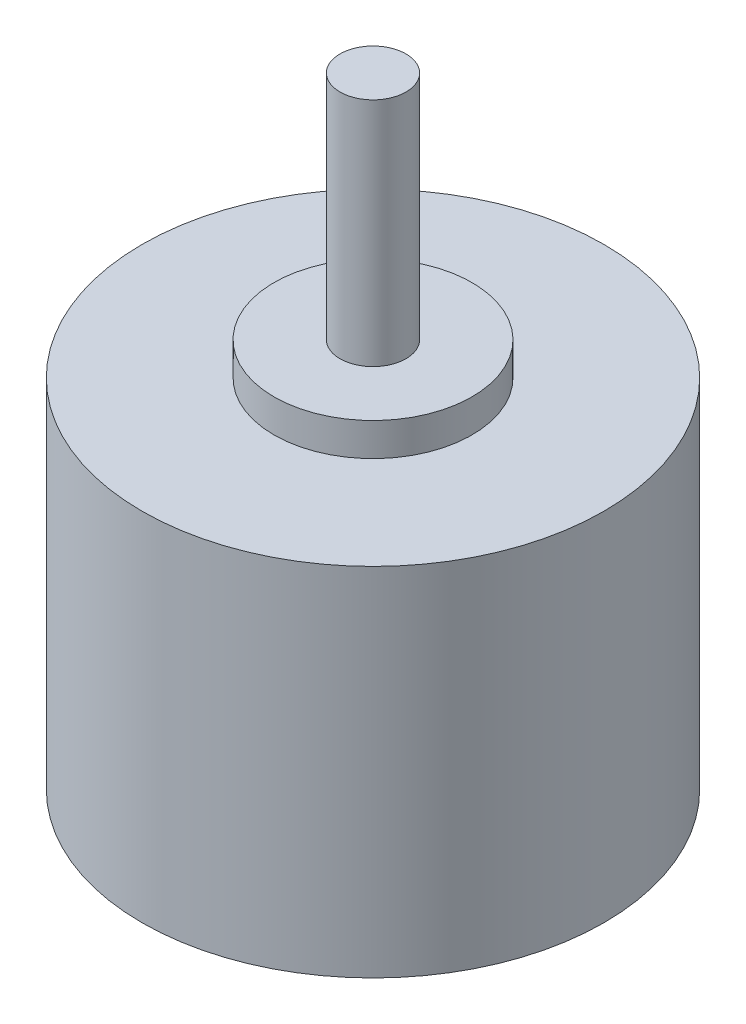
ISO-10303-21;
HEADER;
FILE_DESCRIPTION(('STEP AP214'),'2;1');
FILE_NAME('part.step','',(''),(''),'','','');
FILE_SCHEMA(('AUTOMOTIVE_DESIGN { 1 0 10303 214 1 1 1 1 }'));
ENDSEC;
DATA;
#1=APPLICATION_CONTEXT('core data for automotive mechanical design processes');
#2=APPLICATION_PROTOCOL_DEFINITION('international standard','automotive_design',2000,#1);
#3=PRODUCT_CONTEXT('',#1,'mechanical');
#4=PRODUCT('Part','Part','',(#3));
#5=PRODUCT_RELATED_PRODUCT_CATEGORY('part','',(#4));
#6=PRODUCT_DEFINITION_FORMATION('','',#4);
#7=PRODUCT_DEFINITION_CONTEXT('part definition',#1,'design');
#8=PRODUCT_DEFINITION('design','',#6,#7);
#9=PRODUCT_DEFINITION_SHAPE('','',#8);
#10=(LENGTH_UNIT() NAMED_UNIT(*) SI_UNIT(.MILLI.,.METRE.));
#11=(NAMED_UNIT(*) PLANE_ANGLE_UNIT() SI_UNIT($,.RADIAN.));
#12=(NAMED_UNIT(*) SI_UNIT($,.STERADIAN.) SOLID_ANGLE_UNIT());
#13=UNCERTAINTY_MEASURE_WITH_UNIT(LENGTH_MEASURE(1.E-05),#10,'distance_accuracy_value','');
#14=(GEOMETRIC_REPRESENTATION_CONTEXT(3) GLOBAL_UNCERTAINTY_ASSIGNED_CONTEXT((#13)) GLOBAL_UNIT_ASSIGNED_CONTEXT((#10,
#11,#12)) REPRESENTATION_CONTEXT('',''));
#15=CARTESIAN_POINT('',(0.,0.,0.));
#16=DIRECTION('',(0.,0.,1.));
#17=DIRECTION('',(1.,0.,0.));
#18=AXIS2_PLACEMENT_3D('',#15,#16,#17);
#19=CARTESIAN_POINT('',(0.,27.,0.));
#20=DIRECTION('',(0.,-1.,0.));
#21=DIRECTION('',(0.,0.,-1.));
#22=AXIS2_PLACEMENT_3D('',#19,#20,#21);
#23=CYLINDRICAL_SURFACE('',#22,17.5);
#24=CARTESIAN_POINT('',(0.,27.,0.));
#25=DIRECTION('',(0.,1.,0.));
#26=DIRECTION('',(0.,0.,1.));
#27=AXIS2_PLACEMENT_3D('',#24,#25,#26);
#28=CIRCLE('',#27,17.5);
#29=CARTESIAN_POINT('',(0.,27.,17.5));
#30=VERTEX_POINT('',#29);
#31=EDGE_CURVE('E42',#30,#30,#28,.T.);
#32=ORIENTED_EDGE('',*,*,#31,.F.);
#33=EDGE_LOOP('',(#32));
#34=FACE_BOUND('',#33,.T.);
#35=CARTESIAN_POINT('',(0.,0.,0.));
#36=DIRECTION('',(0.,1.,0.));
#37=DIRECTION('',(0.,0.,1.));
#38=AXIS2_PLACEMENT_3D('',#35,#36,#37);
#39=CIRCLE('',#38,17.5);
#40=CARTESIAN_POINT('',(0.,0.,17.5));
#41=VERTEX_POINT('',#40);
#42=EDGE_CURVE('E33',#41,#41,#39,.T.);
#43=ORIENTED_EDGE('',*,*,#42,.T.);
#44=EDGE_LOOP('',(#43));
#45=FACE_BOUND('',#44,.T.);
#46=ADVANCED_FACE('F30',(#34,#45),#23,.T.);
#47=CARTESIAN_POINT('',(0.,27.,0.));
#48=DIRECTION('',(0.,1.,0.));
#49=DIRECTION('',(0.,0.,1.));
#50=AXIS2_PLACEMENT_3D('',#47,#48,#49);
#51=PLANE('',#50);
#52=CARTESIAN_POINT('',(0.,27.,0.));
#53=DIRECTION('',(0.,1.,0.));
#54=DIRECTION('',(0.,0.,1.));
#55=AXIS2_PLACEMENT_3D('',#52,#53,#54);
#56=CIRCLE('',#55,7.5);
#57=CARTESIAN_POINT('',(0.,27.,7.5));
#58=VERTEX_POINT('',#57);
#59=EDGE_CURVE('E37',#58,#58,#56,.T.);
#60=ORIENTED_EDGE('',*,*,#59,.F.);
#61=EDGE_LOOP('',(#60));
#62=FACE_BOUND('',#61,.T.);
#63=ORIENTED_EDGE('',*,*,#31,.T.);
#64=EDGE_LOOP('',(#63));
#65=FACE_BOUND('',#64,.T.);
#66=ADVANCED_FACE('F59',(#62,#65),#51,.T.);
#67=CARTESIAN_POINT('',(0.,0.,0.));
#68=DIRECTION('',(0.,1.,0.));
#69=DIRECTION('',(0.,0.,1.));
#70=AXIS2_PLACEMENT_3D('',#67,#68,#69);
#71=PLANE('',#70);
#72=ORIENTED_EDGE('',*,*,#42,.F.);
#73=EDGE_LOOP('',(#72));
#74=FACE_BOUND('',#73,.T.);
#75=ADVANCED_FACE('F56',(#74),#71,.F.);
#76=CARTESIAN_POINT('',(0.,29.5,0.));
#77=DIRECTION('',(0.,-1.,0.));
#78=DIRECTION('',(0.,0.,-1.));
#79=AXIS2_PLACEMENT_3D('',#76,#77,#78);
#80=CYLINDRICAL_SURFACE('',#79,7.5);
#81=CARTESIAN_POINT('',(0.,29.5,0.));
#82=DIRECTION('',(0.,1.,0.));
#83=DIRECTION('',(0.,0.,1.));
#84=AXIS2_PLACEMENT_3D('',#81,#82,#83);
#85=CIRCLE('',#84,7.5);
#86=CARTESIAN_POINT('',(0.,29.5,7.5));
#87=VERTEX_POINT('',#86);
#88=EDGE_CURVE('E47',#87,#87,#85,.T.);
#89=ORIENTED_EDGE('',*,*,#88,.F.);
#90=EDGE_LOOP('',(#89));
#91=FACE_BOUND('',#90,.T.);
#92=ORIENTED_EDGE('',*,*,#59,.T.);
#93=EDGE_LOOP('',(#92));
#94=FACE_BOUND('',#93,.T.);
#95=ADVANCED_FACE('F58',(#91,#94),#80,.T.);
#96=CARTESIAN_POINT('',(0.,29.5,0.));
#97=DIRECTION('',(0.,1.,0.));
#98=DIRECTION('',(0.,0.,1.));
#99=AXIS2_PLACEMENT_3D('',#96,#97,#98);
#100=PLANE('',#99);
#101=CARTESIAN_POINT('',(0.,29.5,0.));
#102=DIRECTION('',(0.,1.,0.));
#103=DIRECTION('',(0.,0.,1.));
#104=AXIS2_PLACEMENT_3D('',#101,#102,#103);
#105=CIRCLE('',#104,2.5);
#106=CARTESIAN_POINT('',(0.,29.5,2.5));
#107=VERTEX_POINT('',#106);
#108=EDGE_CURVE('E10',#107,#107,#105,.T.);
#109=ORIENTED_EDGE('',*,*,#108,.F.);
#110=EDGE_LOOP('',(#109));
#111=FACE_BOUND('',#110,.T.);
#112=ORIENTED_EDGE('',*,*,#88,.T.);
#113=EDGE_LOOP('',(#112));
#114=FACE_BOUND('',#113,.T.);
#115=ADVANCED_FACE('F64',(#111,#114),#100,.T.);
#116=CARTESIAN_POINT('',(0.,47.,0.));
#117=DIRECTION('',(0.,-1.,0.));
#118=DIRECTION('',(0.,0.,-1.));
#119=AXIS2_PLACEMENT_3D('',#116,#117,#118);
#120=CYLINDRICAL_SURFACE('',#119,2.5);
#121=CARTESIAN_POINT('',(0.,47.,0.));
#122=DIRECTION('',(0.,1.,0.));
#123=DIRECTION('',(0.,0.,1.));
#124=AXIS2_PLACEMENT_3D('',#121,#122,#123);
#125=CIRCLE('',#124,2.5);
#126=CARTESIAN_POINT('',(0.,47.,2.5));
#127=VERTEX_POINT('',#126);
#128=EDGE_CURVE('E46',#127,#127,#125,.T.);
#129=ORIENTED_EDGE('',*,*,#128,.F.);
#130=EDGE_LOOP('',(#129));
#131=FACE_BOUND('',#130,.T.);
#132=ORIENTED_EDGE('',*,*,#108,.T.);
#133=EDGE_LOOP('',(#132));
#134=FACE_BOUND('',#133,.T.);
#135=ADVANCED_FACE('F94',(#131,#134),#120,.T.);
#136=CARTESIAN_POINT('',(0.,47.,0.));
#137=DIRECTION('',(0.,1.,0.));
#138=DIRECTION('',(0.,0.,1.));
#139=AXIS2_PLACEMENT_3D('',#136,#137,#138);
#140=PLANE('',#139);
#141=ORIENTED_EDGE('',*,*,#128,.T.);
#142=EDGE_LOOP('',(#141));
#143=FACE_BOUND('',#142,.T.);
#144=ADVANCED_FACE('F104',(#143),#140,.T.);
#145=CLOSED_SHELL('',(#46,#66,#75,#95,#115,#135,#144));
#146=MANIFOLD_SOLID_BREP('B2',#145);
#147=ADVANCED_BREP_SHAPE_REPRESENTATION('',(#18,#146),#14);
#148=SHAPE_DEFINITION_REPRESENTATION(#9,#147);
ENDSEC;
END-ISO-10303-21;
